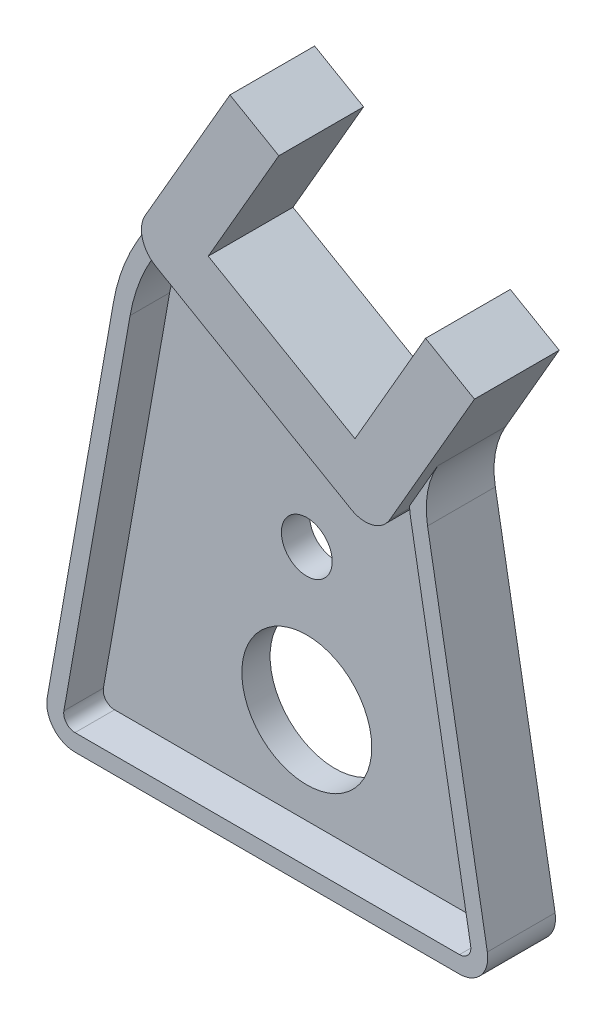
ISO-10303-21;
HEADER;
FILE_DESCRIPTION(('STEP AP214'),'2;1');
FILE_NAME('part.step','',(''),(''),'','','');
FILE_SCHEMA(('AUTOMOTIVE_DESIGN { 1 0 10303 214 1 1 1 1 }'));
ENDSEC;
DATA;
#1=APPLICATION_CONTEXT('core data for automotive mechanical design processes');
#2=APPLICATION_PROTOCOL_DEFINITION('international standard','automotive_design',2000,#1);
#3=PRODUCT_CONTEXT('',#1,'mechanical');
#4=PRODUCT('Part','Part','',(#3));
#5=PRODUCT_RELATED_PRODUCT_CATEGORY('part','',(#4));
#6=PRODUCT_DEFINITION_FORMATION('','',#4);
#7=PRODUCT_DEFINITION_CONTEXT('part definition',#1,'design');
#8=PRODUCT_DEFINITION('design','',#6,#7);
#9=PRODUCT_DEFINITION_SHAPE('','',#8);
#10=(LENGTH_UNIT() NAMED_UNIT(*) SI_UNIT(.MILLI.,.METRE.));
#11=(NAMED_UNIT(*) PLANE_ANGLE_UNIT() SI_UNIT($,.RADIAN.));
#12=(NAMED_UNIT(*) SI_UNIT($,.STERADIAN.) SOLID_ANGLE_UNIT());
#13=UNCERTAINTY_MEASURE_WITH_UNIT(LENGTH_MEASURE(1.E-05),#10,'distance_accuracy_value','');
#14=(GEOMETRIC_REPRESENTATION_CONTEXT(3) GLOBAL_UNCERTAINTY_ASSIGNED_CONTEXT((#13)) GLOBAL_UNIT_ASSIGNED_CONTEXT((#10,
#11,#12)) REPRESENTATION_CONTEXT('',''));
#15=CARTESIAN_POINT('',(0.,0.,0.));
#16=DIRECTION('',(0.,0.,1.));
#17=DIRECTION('',(1.,0.,0.));
#18=AXIS2_PLACEMENT_3D('',#15,#16,#17);
#19=CARTESIAN_POINT('',(0.,0.,5.));
#20=DIRECTION('',(0.,0.,1.));
#21=DIRECTION('',(1.,0.,0.));
#22=AXIS2_PLACEMENT_3D('',#19,#20,#21);
#23=PLANE('',#22);
#24=CARTESIAN_POINT('',(-14.282032302755,89.0192378864667,5.));
#25=DIRECTION('',(0.,0.,1.));
#26=DIRECTION('',(1.,0.,0.));
#27=AXIS2_PLACEMENT_3D('',#24,#25,#26);
#28=CIRCLE('',#27,5.);
#29=CARTESIAN_POINT('',(-18.3053709578019,86.0506109198699,5.));
#30=VERTEX_POINT('',#29);
#31=CARTESIAN_POINT('',(-16.782032302755,84.6891108675445,5.));
#32=VERTEX_POINT('',#31);
#33=EDGE_CURVE('E227',#30,#32,#28,.T.);
#34=ORIENTED_EDGE('',*,*,#33,.F.);
#35=DIRECTION('',(-0.500000000000017,-0.866025403784429,0.));
#36=VECTOR('',#35,1.);
#37=CARTESIAN_POINT('',(-50.9900357522409,29.4391108675463,5.));
#38=LINE('',#37,#36);
#39=CARTESIAN_POINT('',(-20.4875099346972,82.2710353427109,5.));
#40=VERTEX_POINT('',#39);
#41=EDGE_CURVE('E361',#30,#40,#38,.T.);
#42=ORIENTED_EDGE('',*,*,#41,.T.);
#43=CARTESIAN_POINT('',(7.22530298640504,66.2710353427109,5.));
#44=DIRECTION('',(0.,0.,1.));
#45=DIRECTION('',(1.,0.,0.));
#46=AXIS2_PLACEMENT_3D('',#43,#44,#45);
#47=CIRCLE('',#46,32.0000000000001);
#48=CARTESIAN_POINT('',(-24.2885451099856,71.8277770280526,5.));
#49=VERTEX_POINT('',#48);
#50=EDGE_CURVE('E368',#40,#49,#47,.T.);
#51=ORIENTED_EDGE('',*,*,#50,.T.);
#52=DIRECTION('',(-0.173648177666928,-0.984807753012209,0.));
#53=VECTOR('',#52,1.);
#54=CARTESIAN_POINT('',(-35.8394291566816,6.31945833351249,5.));
#55=LINE('',#54,#53);
#56=CARTESIAN_POINT('',(-36.0108475430534,5.34729635533387,5.));
#57=VERTEX_POINT('',#56);
#58=EDGE_CURVE('E369',#49,#57,#55,.T.);
#59=ORIENTED_EDGE('',*,*,#58,.T.);
#60=CARTESIAN_POINT('',(-34.041232037029,5.,5.));
#61=DIRECTION('',(0.,0.,1.));
#62=DIRECTION('',(1.,0.,0.));
#63=AXIS2_PLACEMENT_3D('',#60,#61,#62);
#64=CIRCLE('',#63,2.);
#65=CARTESIAN_POINT('',(-34.0412320370289,3.,5.));
#66=VERTEX_POINT('',#65);
#67=EDGE_CURVE('E348',#57,#66,#64,.T.);
#68=ORIENTED_EDGE('',*,*,#67,.T.);
#69=DIRECTION('',(-1.,0.,0.));
#70=VECTOR('',#69,1.);
#71=CARTESIAN_POINT('',(0.,3.,5.));
#72=LINE('',#71,#70);
#73=CARTESIAN_POINT('',(34.0412320370289,3.,5.));
#74=VERTEX_POINT('',#73);
#75=EDGE_CURVE('E354',#74,#66,#72,.T.);
#76=ORIENTED_EDGE('',*,*,#75,.F.);
#77=CARTESIAN_POINT('',(34.041232037029,5.,5.));
#78=DIRECTION('',(0.,0.,1.));
#79=DIRECTION('',(1.,0.,0.));
#80=AXIS2_PLACEMENT_3D('',#77,#78,#79);
#81=CIRCLE('',#80,2.);
#82=CARTESIAN_POINT('',(36.0108475430534,5.34729635533391,5.));
#83=VERTEX_POINT('',#82);
#84=EDGE_CURVE('E357',#83,#74,#81,.F.);
#85=ORIENTED_EDGE('',*,*,#84,.F.);
#86=DIRECTION('',(-0.173648177666927,0.984807753012209,0.));
#87=VECTOR('',#86,1.);
#88=CARTESIAN_POINT('',(35.8394291566816,6.31945833351247,5.));
#89=LINE('',#88,#87);
#90=CARTESIAN_POINT('',(25.4265109231425,65.3740522005496,5.));
#91=VERTEX_POINT('',#90);
#92=EDGE_CURVE('E358',#83,#91,#89,.T.);
#93=ORIENTED_EDGE('',*,*,#92,.T.);
#94=CARTESIAN_POINT('',(43.1530504773622,68.4997193985543,5.));
#95=DIRECTION('',(0.,0.,1.));
#96=DIRECTION('',(1.,0.,0.));
#97=AXIS2_PLACEMENT_3D('',#94,#95,#96);
#98=CIRCLE('',#97,18.);
#99=CARTESIAN_POINT('',(25.1877322350626,67.3828754287472,5.));
#100=VERTEX_POINT('',#99);
#101=EDGE_CURVE('E363',#100,#91,#98,.T.);
#102=ORIENTED_EDGE('',*,*,#101,.F.);
#103=DIRECTION('',(-0.499999999999999,-0.866025403784439,0.));
#104=VECTOR('',#103,1.);
#105=CARTESIAN_POINT('',(-10.2868417743717,5.93911086754457,5.));
#106=LINE('',#105,#104);
#107=CARTESIAN_POINT('',(24.6891108675448,66.5192378864669,5.));
#108=VERTEX_POINT('',#107);
#109=EDGE_CURVE('E226',#100,#108,#106,.T.);
#110=ORIENTED_EDGE('',*,*,#109,.T.);
#111=CARTESIAN_POINT('',(20.3589838486225,69.0192378864669,5.));
#112=DIRECTION('',(0.,0.,1.));
#113=DIRECTION('',(1.,0.,0.));
#114=AXIS2_PLACEMENT_3D('',#111,#112,#113);
#115=CIRCLE('',#114,5.);
#116=CARTESIAN_POINT('',(17.8589838486225,64.6891108675447,5.));
#117=VERTEX_POINT('',#116);
#118=EDGE_CURVE('E62',#117,#108,#115,.T.);
#119=ORIENTED_EDGE('',*,*,#118,.F.);
#120=DIRECTION('',(0.86602540378444,-0.499999999999998,0.));
#121=VECTOR('',#120,1.);
#122=CARTESIAN_POINT('',(32.4759526419164,56.2500000000002,5.));
#123=LINE('',#122,#121);
#124=EDGE_CURVE('E57',#32,#117,#123,.T.);
#125=ORIENTED_EDGE('',*,*,#124,.F.);
#126=EDGE_LOOP('',(#34,#42,#51,#59,#68,#76,#85,#93,#102,#110,#119,#125));
#127=FACE_BOUND('',#126,.T.);
#128=CARTESIAN_POINT('',(0.,20.,5.));
#129=DIRECTION('',(0.,0.,1.));
#130=DIRECTION('',(1.,0.,0.));
#131=AXIS2_PLACEMENT_3D('',#128,#129,#130);
#132=CIRCLE('',#131,11.5);
#133=CARTESIAN_POINT('',(11.5,20.,5.));
#134=VERTEX_POINT('',#133);
#135=EDGE_CURVE('E373',#134,#134,#132,.T.);
#136=ORIENTED_EDGE('',*,*,#135,.F.);
#137=EDGE_LOOP('',(#136));
#138=FACE_BOUND('',#137,.T.);
#139=CARTESIAN_POINT('',(0.,45.,5.));
#140=DIRECTION('',(0.,0.,1.));
#141=DIRECTION('',(1.,0.,0.));
#142=AXIS2_PLACEMENT_3D('',#139,#140,#141);
#143=CIRCLE('',#142,4.5);
#144=CARTESIAN_POINT('',(4.5,45.,5.));
#145=VERTEX_POINT('',#144);
#146=EDGE_CURVE('E376',#145,#145,#143,.T.);
#147=ORIENTED_EDGE('',*,*,#146,.F.);
#148=EDGE_LOOP('',(#147));
#149=FACE_BOUND('',#148,.T.);
#150=ADVANCED_FACE('F41',(#127,#138,#149),#23,.T.);
#151=CARTESIAN_POINT('',(49.9759526419163,86.5608891324556,5.));
#152=DIRECTION('',(0.499999999999998,0.86602540378444,0.));
#153=DIRECTION('',(-0.86602540378444,0.499999999999998,0.));
#154=AXIS2_PLACEMENT_3D('',#151,#152,#153);
#155=PLANE('',#154);
#156=DIRECTION('',(0.86602540378444,-0.499999999999998,0.));
#157=VECTOR('',#156,1.);
#158=CARTESIAN_POINT('',(49.9759526419163,86.5608891324556,0.));
#159=LINE('',#158,#157);
#160=CARTESIAN_POINT('',(-3.61215932167733,117.5,0.));
#161=VERTEX_POINT('',#160);
#162=CARTESIAN_POINT('',(5.04809471616708,112.5,0.));
#163=VERTEX_POINT('',#162);
#164=EDGE_CURVE('E375',#161,#163,#159,.T.);
#165=ORIENTED_EDGE('',*,*,#164,.F.);
#166=DIRECTION('',(0.,0.,-1.));
#167=VECTOR('',#166,1.);
#168=CARTESIAN_POINT('',(-3.61215932167733,117.5,5.));
#169=LINE('',#168,#167);
#170=CARTESIAN_POINT('',(-3.61215932167733,117.5,15.));
#171=VERTEX_POINT('',#170);
#172=EDGE_CURVE('E11',#171,#161,#169,.T.);
#173=ORIENTED_EDGE('',*,*,#172,.F.);
#174=DIRECTION('',(0.86602540378444,-0.499999999999998,0.));
#175=VECTOR('',#174,1.);
#176=CARTESIAN_POINT('',(49.9759526419163,86.5608891324556,15.));
#177=LINE('',#176,#175);
#178=CARTESIAN_POINT('',(5.04809471616708,112.5,15.));
#179=VERTEX_POINT('',#178);
#180=EDGE_CURVE('E263',#171,#179,#177,.T.);
#181=ORIENTED_EDGE('',*,*,#180,.T.);
#182=DIRECTION('',(0.,0.,-1.));
#183=VECTOR('',#182,1.);
#184=CARTESIAN_POINT('',(5.04809471616708,112.5,5.));
#185=LINE('',#184,#183);
#186=EDGE_CURVE('E379',#179,#163,#185,.T.);
#187=ORIENTED_EDGE('',*,*,#186,.T.);
#188=EDGE_LOOP('',(#165,#173,#181,#187));
#189=FACE_BOUND('',#188,.T.);
#190=ADVANCED_FACE('F43',(#189),#155,.T.);
#191=CARTESIAN_POINT('',(-53.5881119635935,30.9391108675442,5.));
#192=DIRECTION('',(-0.866025403784441,0.499999999999996,0.));
#193=DIRECTION('',(-0.499999999999996,-0.866025403784441,0.));
#194=AXIS2_PLACEMENT_3D('',#191,#192,#193);
#195=PLANE('',#194);
#196=DIRECTION('',(0.499999999999997,0.866025403784441,0.));
#197=VECTOR('',#196,1.);
#198=CARTESIAN_POINT('',(-53.5881119635935,30.9391108675443,15.));
#199=LINE('',#198,#197);
#200=CARTESIAN_POINT('',(-18.6121593216772,91.5192378864667,15.));
#201=VERTEX_POINT('',#200);
#202=EDGE_CURVE('E238',#201,#171,#199,.T.);
#203=ORIENTED_EDGE('',*,*,#202,.T.);
#204=ORIENTED_EDGE('',*,*,#172,.T.);
#205=DIRECTION('',(0.499999999999996,0.866025403784441,0.));
#206=VECTOR('',#205,1.);
#207=CARTESIAN_POINT('',(-53.5881119635935,30.9391108675442,0.));
#208=LINE('',#207,#206);
#209=CARTESIAN_POINT('',(-23.0855861460504,83.7710353427108,0.));
#210=VERTEX_POINT('',#209);
#211=EDGE_CURVE('E382',#210,#161,#208,.T.);
#212=ORIENTED_EDGE('',*,*,#211,.F.);
#213=DIRECTION('',(0.,0.,-1.));
#214=VECTOR('',#213,1.);
#215=CARTESIAN_POINT('',(-23.0855861460504,83.7710353427108,5.));
#216=LINE('',#215,#214);
#217=CARTESIAN_POINT('',(-23.0855861460504,83.7710353427108,12.));
#218=VERTEX_POINT('',#217);
#219=EDGE_CURVE('E47',#218,#210,#216,.T.);
#220=ORIENTED_EDGE('',*,*,#219,.F.);
#221=DIRECTION('',(0.499999999999996,0.866025403784441,0.));
#222=VECTOR('',#221,1.);
#223=CARTESIAN_POINT('',(-53.5881119635935,30.9391108675442,12.));
#224=LINE('',#223,#222);
#225=CARTESIAN_POINT('',(-18.6121593216772,91.5192378864667,12.));
#226=VERTEX_POINT('',#225);
#227=EDGE_CURVE('E287',#218,#226,#224,.T.);
#228=ORIENTED_EDGE('',*,*,#227,.T.);
#229=DIRECTION('',(0.,0.,-1.));
#230=VECTOR('',#229,1.);
#231=CARTESIAN_POINT('',(-18.6121593216772,91.5192378864667,15.));
#232=LINE('',#231,#230);
#233=EDGE_CURVE('E270',#201,#226,#232,.T.);
#234=ORIENTED_EDGE('',*,*,#233,.F.);
#235=EDGE_LOOP('',(#203,#204,#212,#220,#228,#234));
#236=FACE_BOUND('',#235,.T.);
#237=ADVANCED_FACE('F451',(#236),#195,.T.);
#238=CARTESIAN_POINT('',(7.22530298640504,66.2710353427109,5.));
#239=DIRECTION('',(0.,0.,-1.));
#240=DIRECTION('',(-1.,0.,0.));
#241=AXIS2_PLACEMENT_3D('',#238,#239,#240);
#242=CYLINDRICAL_SURFACE('',#241,35.);
#243=CARTESIAN_POINT('',(7.22530298640504,66.2710353427109,0.));
#244=DIRECTION('',(0.,0.,1.));
#245=DIRECTION('',(1.,0.,0.));
#246=AXIS2_PLACEMENT_3D('',#243,#244,#245);
#247=CIRCLE('',#246,35.);
#248=CARTESIAN_POINT('',(-27.2429683690223,72.3487215610534,0.));
#249=VERTEX_POINT('',#248);
#250=EDGE_CURVE('E384',#249,#210,#247,.F.);
#251=ORIENTED_EDGE('',*,*,#250,.F.);
#252=DIRECTION('',(0.,0.,-1.));
#253=VECTOR('',#252,1.);
#254=CARTESIAN_POINT('',(-27.2429683690223,72.3487215610534,5.));
#255=LINE('',#254,#253);
#256=CARTESIAN_POINT('',(-27.2429683690223,72.3487215610534,12.));
#257=VERTEX_POINT('',#256);
#258=EDGE_CURVE('E450',#257,#249,#255,.T.);
#259=ORIENTED_EDGE('',*,*,#258,.F.);
#260=CARTESIAN_POINT('',(7.22530298640504,66.2710353427109,12.));
#261=DIRECTION('',(0.,0.,1.));
#262=DIRECTION('',(1.,0.,0.));
#263=AXIS2_PLACEMENT_3D('',#260,#261,#262);
#264=CIRCLE('',#263,35.);
#265=EDGE_CURVE('E289',#257,#218,#264,.F.);
#266=ORIENTED_EDGE('',*,*,#265,.T.);
#267=ORIENTED_EDGE('',*,*,#219,.T.);
#268=EDGE_LOOP('',(#251,#259,#266,#267));
#269=FACE_BOUND('',#268,.T.);
#270=ADVANCED_FACE('F452',(#269),#242,.T.);
#271=CARTESIAN_POINT('',(-38.7938524157182,6.84040286651326,5.));
#272=DIRECTION('',(-0.984807753012209,0.173648177666927,0.));
#273=DIRECTION('',(-0.173648177666927,-0.984807753012209,0.));
#274=AXIS2_PLACEMENT_3D('',#271,#272,#273);
#275=PLANE('',#274);
#276=DIRECTION('',(0.173648177666927,0.984807753012209,0.));
#277=VECTOR('',#276,1.);
#278=CARTESIAN_POINT('',(-38.7938524157182,6.84040286651326,0.));
#279=LINE('',#278,#277);
#280=CARTESIAN_POINT('',(-38.96527080209,5.86824088833468,0.));
#281=VERTEX_POINT('',#280);
#282=EDGE_CURVE('E389',#281,#249,#279,.T.);
#283=ORIENTED_EDGE('',*,*,#282,.F.);
#284=DIRECTION('',(0.,0.,-1.));
#285=VECTOR('',#284,1.);
#286=CARTESIAN_POINT('',(-38.96527080209,5.86824088833468,5.));
#287=LINE('',#286,#285);
#288=CARTESIAN_POINT('',(-38.96527080209,5.86824088833468,12.));
#289=VERTEX_POINT('',#288);
#290=EDGE_CURVE('E443',#289,#281,#287,.T.);
#291=ORIENTED_EDGE('',*,*,#290,.F.);
#292=DIRECTION('',(0.173648177666927,0.984807753012209,0.));
#293=VECTOR('',#292,1.);
#294=CARTESIAN_POINT('',(-38.7938524157182,6.84040286651326,12.));
#295=LINE('',#294,#293);
#296=EDGE_CURVE('E295',#289,#257,#295,.T.);
#297=ORIENTED_EDGE('',*,*,#296,.T.);
#298=ORIENTED_EDGE('',*,*,#258,.T.);
#299=EDGE_LOOP('',(#283,#291,#297,#298));
#300=FACE_BOUND('',#299,.T.);
#301=ADVANCED_FACE('F461',(#300),#275,.T.);
#302=CARTESIAN_POINT('',(-34.041232037029,5.,5.));
#303=DIRECTION('',(0.,0.,-1.));
#304=DIRECTION('',(-1.,0.,0.));
#305=AXIS2_PLACEMENT_3D('',#302,#303,#304);
#306=CYLINDRICAL_SURFACE('',#305,5.);
#307=CARTESIAN_POINT('',(-34.041232037029,5.,0.));
#308=DIRECTION('',(0.,0.,1.));
#309=DIRECTION('',(1.,0.,0.));
#310=AXIS2_PLACEMENT_3D('',#307,#308,#309);
#311=CIRCLE('',#310,5.);
#312=CARTESIAN_POINT('',(-34.0412320370289,0.,0.));
#313=VERTEX_POINT('',#312);
#314=EDGE_CURVE('E392',#313,#281,#311,.F.);
#315=ORIENTED_EDGE('',*,*,#314,.F.);
#316=DIRECTION('',(0.,0.,-1.));
#317=VECTOR('',#316,1.);
#318=CARTESIAN_POINT('',(-34.0412320370289,0.,5.));
#319=LINE('',#318,#317);
#320=CARTESIAN_POINT('',(-34.0412320370289,0.,12.));
#321=VERTEX_POINT('',#320);
#322=EDGE_CURVE('E444',#321,#313,#319,.T.);
#323=ORIENTED_EDGE('',*,*,#322,.F.);
#324=CARTESIAN_POINT('',(-34.041232037029,5.,12.));
#325=DIRECTION('',(0.,0.,1.));
#326=DIRECTION('',(1.,0.,0.));
#327=AXIS2_PLACEMENT_3D('',#324,#325,#326);
#328=CIRCLE('',#327,5.);
#329=EDGE_CURVE('E293',#321,#289,#328,.F.);
#330=ORIENTED_EDGE('',*,*,#329,.T.);
#331=ORIENTED_EDGE('',*,*,#290,.T.);
#332=EDGE_LOOP('',(#315,#323,#330,#331));
#333=FACE_BOUND('',#332,.T.);
#334=ADVANCED_FACE('F545',(#333),#306,.T.);
#335=CARTESIAN_POINT('',(0.,0.,5.));
#336=DIRECTION('',(0.,1.,0.));
#337=DIRECTION('',(0.,0.,1.));
#338=AXIS2_PLACEMENT_3D('',#335,#336,#337);
#339=PLANE('',#338);
#340=DIRECTION('',(1.,0.,0.));
#341=VECTOR('',#340,1.);
#342=CARTESIAN_POINT('',(0.,0.,0.));
#343=LINE('',#342,#341);
#344=CARTESIAN_POINT('',(34.0412320370289,0.,0.));
#345=VERTEX_POINT('',#344);
#346=EDGE_CURVE('E391',#313,#345,#343,.T.);
#347=ORIENTED_EDGE('',*,*,#346,.T.);
#348=DIRECTION('',(0.,0.,-1.));
#349=VECTOR('',#348,1.);
#350=CARTESIAN_POINT('',(34.0412320370289,0.,5.));
#351=LINE('',#350,#349);
#352=CARTESIAN_POINT('',(34.0412320370289,0.,12.));
#353=VERTEX_POINT('',#352);
#354=EDGE_CURVE('E439',#353,#345,#351,.T.);
#355=ORIENTED_EDGE('',*,*,#354,.F.);
#356=DIRECTION('',(1.,0.,0.));
#357=VECTOR('',#356,1.);
#358=CARTESIAN_POINT('',(0.,0.,12.));
#359=LINE('',#358,#357);
#360=EDGE_CURVE('E299',#321,#353,#359,.T.);
#361=ORIENTED_EDGE('',*,*,#360,.F.);
#362=ORIENTED_EDGE('',*,*,#322,.T.);
#363=EDGE_LOOP('',(#347,#355,#361,#362));
#364=FACE_BOUND('',#363,.T.);
#365=ADVANCED_FACE('F539',(#364),#339,.F.);
#366=CARTESIAN_POINT('',(34.041232037029,5.,5.));
#367=DIRECTION('',(0.,0.,-1.));
#368=DIRECTION('',(-1.,0.,0.));
#369=AXIS2_PLACEMENT_3D('',#366,#367,#368);
#370=CYLINDRICAL_SURFACE('',#369,5.);
#371=CARTESIAN_POINT('',(34.041232037029,5.,0.));
#372=DIRECTION('',(0.,0.,1.));
#373=DIRECTION('',(1.,0.,0.));
#374=AXIS2_PLACEMENT_3D('',#371,#372,#373);
#375=CIRCLE('',#374,5.);
#376=CARTESIAN_POINT('',(38.96527080209,5.86824088833468,0.));
#377=VERTEX_POINT('',#376);
#378=EDGE_CURVE('E397',#345,#377,#375,.T.);
#379=ORIENTED_EDGE('',*,*,#378,.T.);
#380=DIRECTION('',(0.,0.,-1.));
#381=VECTOR('',#380,1.);
#382=CARTESIAN_POINT('',(38.96527080209,5.86824088833468,5.));
#383=LINE('',#382,#381);
#384=CARTESIAN_POINT('',(38.96527080209,5.86824088833468,12.));
#385=VERTEX_POINT('',#384);
#386=EDGE_CURVE('E437',#385,#377,#383,.T.);
#387=ORIENTED_EDGE('',*,*,#386,.F.);
#388=CARTESIAN_POINT('',(34.041232037029,5.,12.));
#389=DIRECTION('',(0.,0.,1.));
#390=DIRECTION('',(1.,0.,0.));
#391=AXIS2_PLACEMENT_3D('',#388,#389,#390);
#392=CIRCLE('',#391,5.);
#393=EDGE_CURVE('E302',#353,#385,#392,.T.);
#394=ORIENTED_EDGE('',*,*,#393,.F.);
#395=ORIENTED_EDGE('',*,*,#354,.T.);
#396=EDGE_LOOP('',(#379,#387,#394,#395));
#397=FACE_BOUND('',#396,.T.);
#398=ADVANCED_FACE('F540',(#397),#370,.T.);
#399=CARTESIAN_POINT('',(38.7938524157182,6.84040286651325,5.));
#400=DIRECTION('',(0.984807753012209,0.173648177666927,0.));
#401=DIRECTION('',(-0.173648177666927,0.984807753012209,0.));
#402=AXIS2_PLACEMENT_3D('',#399,#400,#401);
#403=PLANE('',#402);
#404=DIRECTION('',(0.173648177666927,-0.984807753012209,0.));
#405=VECTOR('',#404,1.);
#406=CARTESIAN_POINT('',(38.7938524157182,6.84040286651325,0.));
#407=LINE('',#406,#405);
#408=CARTESIAN_POINT('',(28.3809341821791,65.8949967335504,0.));
#409=VERTEX_POINT('',#408);
#410=EDGE_CURVE('E399',#409,#377,#407,.T.);
#411=ORIENTED_EDGE('',*,*,#410,.F.);
#412=DIRECTION('',(0.,0.,-1.));
#413=VECTOR('',#412,1.);
#414=CARTESIAN_POINT('',(28.3809341821791,65.8949967335504,5.));
#415=LINE('',#414,#413);
#416=CARTESIAN_POINT('',(28.3809341821791,65.8949967335504,12.));
#417=VERTEX_POINT('',#416);
#418=EDGE_CURVE('E436',#417,#409,#415,.T.);
#419=ORIENTED_EDGE('',*,*,#418,.F.);
#420=DIRECTION('',(0.173648177666927,-0.984807753012209,0.));
#421=VECTOR('',#420,1.);
#422=CARTESIAN_POINT('',(38.7938524157182,6.84040286651325,12.));
#423=LINE('',#422,#421);
#424=EDGE_CURVE('E304',#417,#385,#423,.T.);
#425=ORIENTED_EDGE('',*,*,#424,.T.);
#426=ORIENTED_EDGE('',*,*,#386,.T.);
#427=EDGE_LOOP('',(#411,#419,#425,#426));
#428=FACE_BOUND('',#427,.T.);
#429=ADVANCED_FACE('F534',(#428),#403,.T.);
#430=CARTESIAN_POINT('',(43.1530504773622,68.4997193985543,5.));
#431=DIRECTION('',(0.,0.,-1.));
#432=DIRECTION('',(-1.,0.,0.));
#433=AXIS2_PLACEMENT_3D('',#430,#431,#432);
#434=CYLINDRICAL_SURFACE('',#433,15.);
#435=CARTESIAN_POINT('',(43.1530504773622,68.4997193985543,0.));
#436=DIRECTION('',(0.,0.,1.));
#437=DIRECTION('',(1.,0.,0.));
#438=AXIS2_PLACEMENT_3D('',#435,#436,#437);
#439=CIRCLE('',#438,15.);
#440=CARTESIAN_POINT('',(30.1626694205957,75.9997193985542,0.));
#441=VERTEX_POINT('',#440);
#442=EDGE_CURVE('E405',#409,#441,#439,.F.);
#443=ORIENTED_EDGE('',*,*,#442,.T.);
#444=DIRECTION('',(0.,0.,-1.));
#445=VECTOR('',#444,1.);
#446=CARTESIAN_POINT('',(30.1626694205957,75.9997193985542,5.));
#447=LINE('',#446,#445);
#448=CARTESIAN_POINT('',(30.1626694205957,75.9997193985543,12.));
#449=VERTEX_POINT('',#448);
#450=EDGE_CURVE('E433',#449,#441,#447,.T.);
#451=ORIENTED_EDGE('',*,*,#450,.F.);
#452=CARTESIAN_POINT('',(43.1530504773622,68.4997193985543,12.));
#453=DIRECTION('',(0.,0.,1.));
#454=DIRECTION('',(1.,0.,0.));
#455=AXIS2_PLACEMENT_3D('',#452,#453,#454);
#456=CIRCLE('',#455,15.);
#457=EDGE_CURVE('E307',#417,#449,#456,.F.);
#458=ORIENTED_EDGE('',*,*,#457,.F.);
#459=ORIENTED_EDGE('',*,*,#418,.T.);
#460=EDGE_LOOP('',(#443,#451,#458,#459));
#461=FACE_BOUND('',#460,.T.);
#462=ADVANCED_FACE('F529',(#461),#434,.F.);
#463=CARTESIAN_POINT('',(-10.2868417743717,5.93911086754457,5.));
#464=DIRECTION('',(-0.866025403784439,0.499999999999999,0.));
#465=DIRECTION('',(-0.499999999999999,-0.866025403784439,0.));
#466=AXIS2_PLACEMENT_3D('',#463,#464,#465);
#467=PLANE('',#466);
#468=DIRECTION('',(0.499999999999999,0.866025403784439,0.));
#469=VECTOR('',#468,1.);
#470=CARTESIAN_POINT('',(-10.2868417743717,5.93911086754457,0.));
#471=LINE('',#470,#469);
#472=CARTESIAN_POINT('',(39.6891108675447,92.5000000000001,0.));
#473=VERTEX_POINT('',#472);
#474=EDGE_CURVE('E404',#441,#473,#471,.T.);
#475=ORIENTED_EDGE('',*,*,#474,.T.);
#476=DIRECTION('',(0.,0.,-1.));
#477=VECTOR('',#476,1.);
#478=CARTESIAN_POINT('',(39.6891108675447,92.5000000000001,5.));
#479=LINE('',#478,#477);
#480=CARTESIAN_POINT('',(39.6891108675447,92.5000000000001,15.));
#481=VERTEX_POINT('',#480);
#482=EDGE_CURVE('E431',#481,#473,#479,.T.);
#483=ORIENTED_EDGE('',*,*,#482,.F.);
#484=DIRECTION('',(0.499999999999999,0.866025403784439,0.));
#485=VECTOR('',#484,1.);
#486=CARTESIAN_POINT('',(-10.2868417743717,5.93911086754457,15.));
#487=LINE('',#486,#485);
#488=CARTESIAN_POINT('',(24.6891108675448,66.5192378864669,15.));
#489=VERTEX_POINT('',#488);
#490=EDGE_CURVE('E247',#489,#481,#487,.T.);
#491=ORIENTED_EDGE('',*,*,#490,.F.);
#492=DIRECTION('',(0.,0.,-1.));
#493=VECTOR('',#492,1.);
#494=CARTESIAN_POINT('',(24.6891108675448,66.5192378864669,15.));
#495=LINE('',#494,#493);
#496=EDGE_CURVE('E267',#489,#108,#495,.T.);
#497=ORIENTED_EDGE('',*,*,#496,.T.);
#498=ORIENTED_EDGE('',*,*,#109,.F.);
#499=DIRECTION('',(0.,0.,-1.));
#500=VECTOR('',#499,1.);
#501=CARTESIAN_POINT('',(25.1877322350626,67.3828754287472,12.));
#502=LINE('',#501,#500);
#503=CARTESIAN_POINT('',(25.1877322350626,67.3828754287472,12.));
#504=VERTEX_POINT('',#503);
#505=EDGE_CURVE('E338',#504,#100,#502,.T.);
#506=ORIENTED_EDGE('',*,*,#505,.F.);
#507=DIRECTION('',(0.499999999999999,0.866025403784439,0.));
#508=VECTOR('',#507,1.);
#509=CARTESIAN_POINT('',(-10.2868417743717,5.93911086754457,12.));
#510=LINE('',#509,#508);
#511=EDGE_CURVE('E309',#504,#449,#510,.T.);
#512=ORIENTED_EDGE('',*,*,#511,.T.);
#513=ORIENTED_EDGE('',*,*,#450,.T.);
#514=EDGE_LOOP('',(#475,#483,#491,#497,#498,#506,#512,#513));
#515=FACE_BOUND('',#514,.T.);
#516=ADVANCED_FACE('F501',(#515),#467,.F.);
#517=CARTESIAN_POINT('',(49.9759526419163,86.5608891324556,5.));
#518=DIRECTION('',(0.499999999999998,0.86602540378444,0.));
#519=DIRECTION('',(-0.86602540378444,0.499999999999998,0.));
#520=AXIS2_PLACEMENT_3D('',#517,#518,#519);
#521=PLANE('',#520);
#522=DIRECTION('',(0.86602540378444,-0.499999999999998,0.));
#523=VECTOR('',#522,1.);
#524=CARTESIAN_POINT('',(49.9759526419163,86.5608891324556,0.));
#525=LINE('',#524,#523);
#526=CARTESIAN_POINT('',(31.0288568297003,97.5000000000001,0.));
#527=VERTEX_POINT('',#526);
#528=EDGE_CURVE('E410',#527,#473,#525,.T.);
#529=ORIENTED_EDGE('',*,*,#528,.F.);
#530=DIRECTION('',(0.,0.,-1.));
#531=VECTOR('',#530,1.);
#532=CARTESIAN_POINT('',(31.0288568297003,97.5000000000001,5.));
#533=LINE('',#532,#531);
#534=CARTESIAN_POINT('',(31.0288568297003,97.5000000000001,15.));
#535=VERTEX_POINT('',#534);
#536=EDGE_CURVE('E427',#535,#527,#533,.T.);
#537=ORIENTED_EDGE('',*,*,#536,.F.);
#538=DIRECTION('',(0.86602540378444,-0.499999999999998,0.));
#539=VECTOR('',#538,1.);
#540=CARTESIAN_POINT('',(49.9759526419163,86.5608891324556,15.));
#541=LINE('',#540,#539);
#542=EDGE_CURVE('E253',#535,#481,#541,.T.);
#543=ORIENTED_EDGE('',*,*,#542,.T.);
#544=ORIENTED_EDGE('',*,*,#482,.T.);
#545=EDGE_LOOP('',(#529,#537,#543,#544));
#546=FACE_BOUND('',#545,.T.);
#547=ADVANCED_FACE('F515',(#546),#521,.T.);
#548=CARTESIAN_POINT('',(-18.947095812216,10.9391108675445,5.));
#549=DIRECTION('',(-0.86602540378444,0.499999999999998,0.));
#550=DIRECTION('',(-0.499999999999998,-0.86602540378444,0.));
#551=AXIS2_PLACEMENT_3D('',#548,#549,#550);
#552=PLANE('',#551);
#553=DIRECTION('',(0.499999999999998,0.86602540378444,0.));
#554=VECTOR('',#553,1.);
#555=CARTESIAN_POINT('',(-18.947095812216,10.9391108675445,0.));
#556=LINE('',#555,#554);
#557=CARTESIAN_POINT('',(18.5288568297003,75.849364905389,0.));
#558=VERTEX_POINT('',#557);
#559=EDGE_CURVE('E408',#558,#527,#556,.T.);
#560=ORIENTED_EDGE('',*,*,#559,.F.);
#561=DIRECTION('',(0.,0.,-1.));
#562=VECTOR('',#561,1.);
#563=CARTESIAN_POINT('',(18.5288568297003,75.849364905389,5.));
#564=LINE('',#563,#562);
#565=CARTESIAN_POINT('',(18.5288568297003,75.849364905389,15.));
#566=VERTEX_POINT('',#565);
#567=EDGE_CURVE('E430',#566,#558,#564,.T.);
#568=ORIENTED_EDGE('',*,*,#567,.F.);
#569=DIRECTION('',(0.499999999999998,0.86602540378444,0.));
#570=VECTOR('',#569,1.);
#571=CARTESIAN_POINT('',(-18.947095812216,10.9391108675445,15.));
#572=LINE('',#571,#570);
#573=EDGE_CURVE('E255',#566,#535,#572,.T.);
#574=ORIENTED_EDGE('',*,*,#573,.T.);
#575=ORIENTED_EDGE('',*,*,#536,.T.);
#576=EDGE_LOOP('',(#560,#568,#574,#575));
#577=FACE_BOUND('',#576,.T.);
#578=ADVANCED_FACE('F513',(#577),#552,.T.);
#579=CARTESIAN_POINT('',(37.4759526419163,64.9102540378446,5.));
#580=DIRECTION('',(0.499999999999998,0.86602540378444,0.));
#581=DIRECTION('',(-0.86602540378444,0.499999999999998,0.));
#582=AXIS2_PLACEMENT_3D('',#579,#580,#581);
#583=PLANE('',#582);
#584=DIRECTION('',(0.86602540378444,-0.499999999999998,0.));
#585=VECTOR('',#584,1.);
#586=CARTESIAN_POINT('',(37.4759526419163,64.9102540378446,0.));
#587=LINE('',#586,#585);
#588=CARTESIAN_POINT('',(-7.45190528383283,90.849364905389,0.));
#589=VERTEX_POINT('',#588);
#590=EDGE_CURVE('E413',#589,#558,#587,.T.);
#591=ORIENTED_EDGE('',*,*,#590,.F.);
#592=DIRECTION('',(0.,0.,-1.));
#593=VECTOR('',#592,1.);
#594=CARTESIAN_POINT('',(-7.45190528383283,90.849364905389,5.));
#595=LINE('',#594,#593);
#596=CARTESIAN_POINT('',(-7.45190528383283,90.849364905389,15.));
#597=VERTEX_POINT('',#596);
#598=EDGE_CURVE('E422',#597,#589,#595,.T.);
#599=ORIENTED_EDGE('',*,*,#598,.F.);
#600=DIRECTION('',(0.86602540378444,-0.499999999999998,0.));
#601=VECTOR('',#600,1.);
#602=CARTESIAN_POINT('',(37.4759526419163,64.9102540378446,15.));
#603=LINE('',#602,#601);
#604=EDGE_CURVE('E260',#597,#566,#603,.T.);
#605=ORIENTED_EDGE('',*,*,#604,.T.);
#606=ORIENTED_EDGE('',*,*,#567,.T.);
#607=EDGE_LOOP('',(#591,#599,#605,#606));
#608=FACE_BOUND('',#607,.T.);
#609=ADVANCED_FACE('F518',(#608),#583,.T.);
#610=CARTESIAN_POINT('',(0.,20.,5.));
#611=DIRECTION('',(0.,0.,-1.));
#612=DIRECTION('',(-1.,0.,0.));
#613=AXIS2_PLACEMENT_3D('',#610,#611,#612);
#614=CYLINDRICAL_SURFACE('',#613,11.5);
#615=ORIENTED_EDGE('',*,*,#135,.T.);
#616=EDGE_LOOP('',(#615));
#617=FACE_BOUND('',#616,.T.);
#618=CARTESIAN_POINT('',(0.,20.,0.));
#619=DIRECTION('',(0.,0.,1.));
#620=DIRECTION('',(1.,0.,0.));
#621=AXIS2_PLACEMENT_3D('',#618,#619,#620);
#622=CIRCLE('',#621,11.5);
#623=CARTESIAN_POINT('',(11.5,20.,0.));
#624=VERTEX_POINT('',#623);
#625=EDGE_CURVE('E420',#624,#624,#622,.T.);
#626=ORIENTED_EDGE('',*,*,#625,.F.);
#627=EDGE_LOOP('',(#626));
#628=FACE_BOUND('',#627,.T.);
#629=ADVANCED_FACE('F567',(#617,#628),#614,.F.);
#630=CARTESIAN_POINT('',(-44.9278579257491,25.9391108675443,5.));
#631=DIRECTION('',(0.86602540378444,-0.499999999999997,0.));
#632=DIRECTION('',(0.499999999999997,0.86602540378444,0.));
#633=AXIS2_PLACEMENT_3D('',#630,#631,#632);
#634=PLANE('',#633);
#635=DIRECTION('',(-0.499999999999997,-0.86602540378444,0.));
#636=VECTOR('',#635,1.);
#637=CARTESIAN_POINT('',(-44.9278579257491,25.9391108675443,0.));
#638=LINE('',#637,#636);
#639=EDGE_CURVE('E418',#163,#589,#638,.T.);
#640=ORIENTED_EDGE('',*,*,#639,.F.);
#641=ORIENTED_EDGE('',*,*,#186,.F.);
#642=DIRECTION('',(-0.499999999999997,-0.86602540378444,0.));
#643=VECTOR('',#642,1.);
#644=CARTESIAN_POINT('',(-44.9278579257491,25.9391108675443,15.));
#645=LINE('',#644,#643);
#646=EDGE_CURVE('E257',#179,#597,#645,.T.);
#647=ORIENTED_EDGE('',*,*,#646,.T.);
#648=ORIENTED_EDGE('',*,*,#598,.T.);
#649=EDGE_LOOP('',(#640,#641,#647,#648));
#650=FACE_BOUND('',#649,.T.);
#651=ADVANCED_FACE('F523',(#650),#634,.T.);
#652=CARTESIAN_POINT('',(0.,45.,5.));
#653=DIRECTION('',(0.,0.,-1.));
#654=DIRECTION('',(-1.,0.,0.));
#655=AXIS2_PLACEMENT_3D('',#652,#653,#654);
#656=CYLINDRICAL_SURFACE('',#655,4.5);
#657=ORIENTED_EDGE('',*,*,#146,.T.);
#658=EDGE_LOOP('',(#657));
#659=FACE_BOUND('',#658,.T.);
#660=CARTESIAN_POINT('',(0.,45.,0.));
#661=DIRECTION('',(0.,0.,1.));
#662=DIRECTION('',(1.,0.,0.));
#663=AXIS2_PLACEMENT_3D('',#660,#661,#662);
#664=CIRCLE('',#663,4.5);
#665=CARTESIAN_POINT('',(4.5,45.,0.));
#666=VERTEX_POINT('',#665);
#667=EDGE_CURVE('E380',#666,#666,#664,.T.);
#668=ORIENTED_EDGE('',*,*,#667,.F.);
#669=EDGE_LOOP('',(#668));
#670=FACE_BOUND('',#669,.T.);
#671=ADVANCED_FACE('F565',(#659,#670),#656,.F.);
#672=CARTESIAN_POINT('',(0.,0.,0.));
#673=DIRECTION('',(0.,0.,1.));
#674=DIRECTION('',(1.,0.,0.));
#675=AXIS2_PLACEMENT_3D('',#672,#673,#674);
#676=PLANE('',#675);
#677=ORIENTED_EDGE('',*,*,#211,.T.);
#678=ORIENTED_EDGE('',*,*,#164,.T.);
#679=ORIENTED_EDGE('',*,*,#639,.T.);
#680=ORIENTED_EDGE('',*,*,#590,.T.);
#681=ORIENTED_EDGE('',*,*,#559,.T.);
#682=ORIENTED_EDGE('',*,*,#528,.T.);
#683=ORIENTED_EDGE('',*,*,#474,.F.);
#684=ORIENTED_EDGE('',*,*,#442,.F.);
#685=ORIENTED_EDGE('',*,*,#410,.T.);
#686=ORIENTED_EDGE('',*,*,#378,.F.);
#687=ORIENTED_EDGE('',*,*,#346,.F.);
#688=ORIENTED_EDGE('',*,*,#314,.T.);
#689=ORIENTED_EDGE('',*,*,#282,.T.);
#690=ORIENTED_EDGE('',*,*,#250,.T.);
#691=EDGE_LOOP('',(#677,#678,#679,#680,#681,#682,#683,#684,#685,#686,#687,#688,#689,#690));
#692=FACE_BOUND('',#691,.T.);
#693=ORIENTED_EDGE('',*,*,#625,.T.);
#694=EDGE_LOOP('',(#693));
#695=FACE_BOUND('',#694,.T.);
#696=ORIENTED_EDGE('',*,*,#667,.T.);
#697=EDGE_LOOP('',(#696));
#698=FACE_BOUND('',#697,.T.);
#699=ADVANCED_FACE('F456',(#692,#695,#698),#676,.F.);
#700=CARTESIAN_POINT('',(-35.8394291566816,6.31945833351249,12.));
#701=DIRECTION('',(-0.984807753012208,0.173648177666928,0.));
#702=DIRECTION('',(-0.173648177666928,-0.984807753012209,0.));
#703=AXIS2_PLACEMENT_3D('',#700,#701,#702);
#704=PLANE('',#703);
#705=ORIENTED_EDGE('',*,*,#58,.F.);
#706=DIRECTION('',(0.,0.,-1.));
#707=VECTOR('',#706,1.);
#708=CARTESIAN_POINT('',(-24.2885451099856,71.8277770280526,12.));
#709=LINE('',#708,#707);
#710=CARTESIAN_POINT('',(-24.2885451099856,71.8277770280526,12.));
#711=VERTEX_POINT('',#710);
#712=EDGE_CURVE('E350',#711,#49,#709,.T.);
#713=ORIENTED_EDGE('',*,*,#712,.F.);
#714=DIRECTION('',(0.173648177666928,0.984807753012209,0.));
#715=VECTOR('',#714,1.);
#716=CARTESIAN_POINT('',(-35.8394291566816,6.31945833351249,12.));
#717=LINE('',#716,#715);
#718=CARTESIAN_POINT('',(-36.0108475430534,5.34729635533387,12.));
#719=VERTEX_POINT('',#718);
#720=EDGE_CURVE('E280',#719,#711,#717,.T.);
#721=ORIENTED_EDGE('',*,*,#720,.F.);
#722=DIRECTION('',(0.,0.,-1.));
#723=VECTOR('',#722,1.);
#724=CARTESIAN_POINT('',(-36.0108475430534,5.34729635533387,12.));
#725=LINE('',#724,#723);
#726=EDGE_CURVE('E326',#719,#57,#725,.T.);
#727=ORIENTED_EDGE('',*,*,#726,.T.);
#728=EDGE_LOOP('',(#705,#713,#721,#727));
#729=FACE_BOUND('',#728,.T.);
#730=ADVANCED_FACE('F481',(#729),#704,.F.);
#731=CARTESIAN_POINT('',(7.22530298640504,66.2710353427109,12.));
#732=DIRECTION('',(0.,0.,-1.));
#733=DIRECTION('',(-1.,0.,0.));
#734=AXIS2_PLACEMENT_3D('',#731,#732,#733);
#735=CYLINDRICAL_SURFACE('',#734,32.0000000000001);
#736=ORIENTED_EDGE('',*,*,#50,.F.);
#737=DIRECTION('',(0.,0.,-1.));
#738=VECTOR('',#737,1.);
#739=CARTESIAN_POINT('',(-20.4875099346972,82.2710353427109,12.));
#740=LINE('',#739,#738);
#741=CARTESIAN_POINT('',(-20.4875099346972,82.2710353427109,12.));
#742=VERTEX_POINT('',#741);
#743=EDGE_CURVE('E344',#742,#40,#740,.T.);
#744=ORIENTED_EDGE('',*,*,#743,.F.);
#745=CARTESIAN_POINT('',(7.22530298640504,66.2710353427109,12.));
#746=DIRECTION('',(0.,0.,1.));
#747=DIRECTION('',(1.,0.,0.));
#748=AXIS2_PLACEMENT_3D('',#745,#746,#747);
#749=CIRCLE('',#748,32.0000000000001);
#750=EDGE_CURVE('E278',#711,#742,#749,.F.);
#751=ORIENTED_EDGE('',*,*,#750,.F.);
#752=ORIENTED_EDGE('',*,*,#712,.T.);
#753=EDGE_LOOP('',(#736,#744,#751,#752));
#754=FACE_BOUND('',#753,.T.);
#755=ADVANCED_FACE('F480',(#754),#735,.F.);
#756=CARTESIAN_POINT('',(-50.9900357522409,29.4391108675463,12.));
#757=DIRECTION('',(-0.866025403784429,0.500000000000017,0.));
#758=DIRECTION('',(-0.500000000000017,-0.866025403784429,0.));
#759=AXIS2_PLACEMENT_3D('',#756,#757,#758);
#760=PLANE('',#759);
#761=ORIENTED_EDGE('',*,*,#41,.F.);
#762=DIRECTION('',(0.,0.,-1.));
#763=VECTOR('',#762,1.);
#764=CARTESIAN_POINT('',(-18.3053709578019,86.0506109198699,12.));
#765=LINE('',#764,#763);
#766=CARTESIAN_POINT('',(-18.3053709578019,86.0506109198699,12.));
#767=VERTEX_POINT('',#766);
#768=EDGE_CURVE('E345',#767,#30,#765,.T.);
#769=ORIENTED_EDGE('',*,*,#768,.F.);
#770=DIRECTION('',(0.500000000000017,0.866025403784429,0.));
#771=VECTOR('',#770,1.);
#772=CARTESIAN_POINT('',(-50.9900357522409,29.4391108675463,12.));
#773=LINE('',#772,#771);
#774=EDGE_CURVE('E285',#742,#767,#773,.T.);
#775=ORIENTED_EDGE('',*,*,#774,.F.);
#776=ORIENTED_EDGE('',*,*,#743,.T.);
#777=EDGE_LOOP('',(#761,#769,#775,#776));
#778=FACE_BOUND('',#777,.T.);
#779=ADVANCED_FACE('F471',(#778),#760,.F.);
#780=CARTESIAN_POINT('',(43.1530504773622,68.4997193985543,12.));
#781=DIRECTION('',(0.,0.,-1.));
#782=DIRECTION('',(-1.,0.,0.));
#783=AXIS2_PLACEMENT_3D('',#780,#781,#782);
#784=CYLINDRICAL_SURFACE('',#783,18.);
#785=ORIENTED_EDGE('',*,*,#505,.T.);
#786=ORIENTED_EDGE('',*,*,#101,.T.);
#787=DIRECTION('',(0.,0.,-1.));
#788=VECTOR('',#787,1.);
#789=CARTESIAN_POINT('',(25.4265109231425,65.3740522005496,12.));
#790=LINE('',#789,#788);
#791=CARTESIAN_POINT('',(25.4265109231425,65.3740522005496,12.));
#792=VERTEX_POINT('',#791);
#793=EDGE_CURVE('E340',#792,#91,#790,.T.);
#794=ORIENTED_EDGE('',*,*,#793,.F.);
#795=CARTESIAN_POINT('',(43.1530504773622,68.4997193985543,12.));
#796=DIRECTION('',(0.,0.,1.));
#797=DIRECTION('',(1.,0.,0.));
#798=AXIS2_PLACEMENT_3D('',#795,#796,#797);
#799=CIRCLE('',#798,18.);
#800=EDGE_CURVE('E311',#792,#504,#799,.F.);
#801=ORIENTED_EDGE('',*,*,#800,.T.);
#802=EDGE_LOOP('',(#785,#786,#794,#801));
#803=FACE_BOUND('',#802,.T.);
#804=ADVANCED_FACE('F613',(#803),#784,.T.);
#805=CARTESIAN_POINT('',(35.8394291566816,6.31945833351247,12.));
#806=DIRECTION('',(0.984807753012208,0.173648177666927,0.));
#807=DIRECTION('',(-0.173648177666927,0.984807753012209,0.));
#808=AXIS2_PLACEMENT_3D('',#805,#806,#807);
#809=PLANE('',#808);
#810=ORIENTED_EDGE('',*,*,#92,.F.);
#811=DIRECTION('',(0.,0.,-1.));
#812=VECTOR('',#811,1.);
#813=CARTESIAN_POINT('',(36.0108475430534,5.34729635533391,12.));
#814=LINE('',#813,#812);
#815=CARTESIAN_POINT('',(36.0108475430534,5.34729635533391,12.));
#816=VERTEX_POINT('',#815);
#817=EDGE_CURVE('E331',#816,#83,#814,.T.);
#818=ORIENTED_EDGE('',*,*,#817,.F.);
#819=DIRECTION('',(0.173648177666927,-0.984807753012209,0.));
#820=VECTOR('',#819,1.);
#821=CARTESIAN_POINT('',(35.8394291566816,6.31945833351247,12.));
#822=LINE('',#821,#820);
#823=EDGE_CURVE('E316',#792,#816,#822,.T.);
#824=ORIENTED_EDGE('',*,*,#823,.F.);
#825=ORIENTED_EDGE('',*,*,#793,.T.);
#826=EDGE_LOOP('',(#810,#818,#824,#825));
#827=FACE_BOUND('',#826,.T.);
#828=ADVANCED_FACE('F499',(#827),#809,.F.);
#829=CARTESIAN_POINT('',(34.041232037029,5.,12.));
#830=DIRECTION('',(0.,0.,-1.));
#831=DIRECTION('',(-1.,0.,0.));
#832=AXIS2_PLACEMENT_3D('',#829,#830,#831);
#833=CYLINDRICAL_SURFACE('',#832,2.);
#834=ORIENTED_EDGE('',*,*,#817,.T.);
#835=ORIENTED_EDGE('',*,*,#84,.T.);
#836=DIRECTION('',(0.,0.,-1.));
#837=VECTOR('',#836,1.);
#838=CARTESIAN_POINT('',(34.0412320370289,3.,12.));
#839=LINE('',#838,#837);
#840=CARTESIAN_POINT('',(34.0412320370289,3.,12.));
#841=VERTEX_POINT('',#840);
#842=EDGE_CURVE('E332',#841,#74,#839,.T.);
#843=ORIENTED_EDGE('',*,*,#842,.F.);
#844=CARTESIAN_POINT('',(34.041232037029,5.,12.));
#845=DIRECTION('',(0.,0.,1.));
#846=DIRECTION('',(1.,0.,0.));
#847=AXIS2_PLACEMENT_3D('',#844,#845,#846);
#848=CIRCLE('',#847,2.);
#849=EDGE_CURVE('E318',#841,#816,#848,.T.);
#850=ORIENTED_EDGE('',*,*,#849,.T.);
#851=EDGE_LOOP('',(#834,#835,#843,#850));
#852=FACE_BOUND('',#851,.T.);
#853=ADVANCED_FACE('F492',(#852),#833,.F.);
#854=CARTESIAN_POINT('',(0.,3.,12.));
#855=DIRECTION('',(0.,1.,0.));
#856=DIRECTION('',(-1.,0.,0.));
#857=AXIS2_PLACEMENT_3D('',#854,#855,#856);
#858=PLANE('',#857);
#859=ORIENTED_EDGE('',*,*,#842,.T.);
#860=ORIENTED_EDGE('',*,*,#75,.T.);
#861=DIRECTION('',(0.,0.,-1.));
#862=VECTOR('',#861,1.);
#863=CARTESIAN_POINT('',(-34.0412320370289,3.,12.));
#864=LINE('',#863,#862);
#865=CARTESIAN_POINT('',(-34.0412320370289,3.,12.));
#866=VERTEX_POINT('',#865);
#867=EDGE_CURVE('E328',#866,#66,#864,.T.);
#868=ORIENTED_EDGE('',*,*,#867,.F.);
#869=DIRECTION('',(1.,0.,0.));
#870=VECTOR('',#869,1.);
#871=CARTESIAN_POINT('',(0.,3.,12.));
#872=LINE('',#871,#870);
#873=EDGE_CURVE('E321',#866,#841,#872,.T.);
#874=ORIENTED_EDGE('',*,*,#873,.T.);
#875=EDGE_LOOP('',(#859,#860,#868,#874));
#876=FACE_BOUND('',#875,.T.);
#877=ADVANCED_FACE('F489',(#876),#858,.T.);
#878=CARTESIAN_POINT('',(-34.041232037029,5.,12.));
#879=DIRECTION('',(0.,0.,-1.));
#880=DIRECTION('',(-1.,0.,0.));
#881=AXIS2_PLACEMENT_3D('',#878,#879,#880);
#882=CYLINDRICAL_SURFACE('',#881,2.);
#883=ORIENTED_EDGE('',*,*,#67,.F.);
#884=ORIENTED_EDGE('',*,*,#726,.F.);
#885=CARTESIAN_POINT('',(-34.041232037029,5.,12.));
#886=DIRECTION('',(0.,0.,1.));
#887=DIRECTION('',(1.,0.,0.));
#888=AXIS2_PLACEMENT_3D('',#885,#886,#887);
#889=CIRCLE('',#888,2.);
#890=EDGE_CURVE('E322',#866,#719,#889,.F.);
#891=ORIENTED_EDGE('',*,*,#890,.F.);
#892=ORIENTED_EDGE('',*,*,#867,.T.);
#893=EDGE_LOOP('',(#883,#884,#891,#892));
#894=FACE_BOUND('',#893,.T.);
#895=ADVANCED_FACE('F484',(#894),#882,.F.);
#896=CARTESIAN_POINT('',(0.,0.,12.));
#897=DIRECTION('',(0.,0.,1.));
#898=DIRECTION('',(1.,0.,0.));
#899=AXIS2_PLACEMENT_3D('',#896,#897,#898);
#900=PLANE('',#899);
#901=ORIENTED_EDGE('',*,*,#720,.T.);
#902=ORIENTED_EDGE('',*,*,#750,.T.);
#903=ORIENTED_EDGE('',*,*,#774,.T.);
#904=CARTESIAN_POINT('',(-14.282032302755,89.0192378864667,12.));
#905=DIRECTION('',(0.,0.,1.));
#906=DIRECTION('',(1.,0.,0.));
#907=AXIS2_PLACEMENT_3D('',#904,#905,#906);
#908=CIRCLE('',#907,5.);
#909=EDGE_CURVE('E281',#767,#226,#908,.F.);
#910=ORIENTED_EDGE('',*,*,#909,.T.);
#911=ORIENTED_EDGE('',*,*,#227,.F.);
#912=ORIENTED_EDGE('',*,*,#265,.F.);
#913=ORIENTED_EDGE('',*,*,#296,.F.);
#914=ORIENTED_EDGE('',*,*,#329,.F.);
#915=ORIENTED_EDGE('',*,*,#360,.T.);
#916=ORIENTED_EDGE('',*,*,#393,.T.);
#917=ORIENTED_EDGE('',*,*,#424,.F.);
#918=ORIENTED_EDGE('',*,*,#457,.T.);
#919=ORIENTED_EDGE('',*,*,#511,.F.);
#920=ORIENTED_EDGE('',*,*,#800,.F.);
#921=ORIENTED_EDGE('',*,*,#823,.T.);
#922=ORIENTED_EDGE('',*,*,#849,.F.);
#923=ORIENTED_EDGE('',*,*,#873,.F.);
#924=ORIENTED_EDGE('',*,*,#890,.T.);
#925=EDGE_LOOP('',(#901,#902,#903,#910,#911,#912,#913,#914,#915,#916,#917,#918,#919,#920,#921,
#922,#923,#924));
#926=FACE_BOUND('',#925,.T.);
#927=ADVANCED_FACE('F470',(#926),#900,.T.);
#928=CARTESIAN_POINT('',(-14.282032302755,89.0192378864667,15.));
#929=DIRECTION('',(0.,0.,-1.));
#930=DIRECTION('',(-1.,0.,0.));
#931=AXIS2_PLACEMENT_3D('',#928,#929,#930);
#932=CYLINDRICAL_SURFACE('',#931,5.);
#933=ORIENTED_EDGE('',*,*,#909,.F.);
#934=ORIENTED_EDGE('',*,*,#768,.T.);
#935=ORIENTED_EDGE('',*,*,#33,.T.);
#936=DIRECTION('',(0.,0.,-1.));
#937=VECTOR('',#936,1.);
#938=CARTESIAN_POINT('',(-16.782032302755,84.6891108675445,15.));
#939=LINE('',#938,#937);
#940=CARTESIAN_POINT('',(-16.782032302755,84.6891108675445,15.));
#941=VERTEX_POINT('',#940);
#942=EDGE_CURVE('E217',#941,#32,#939,.T.);
#943=ORIENTED_EDGE('',*,*,#942,.F.);
#944=CARTESIAN_POINT('',(-14.282032302755,89.0192378864667,15.));
#945=DIRECTION('',(0.,0.,1.));
#946=DIRECTION('',(1.,0.,0.));
#947=AXIS2_PLACEMENT_3D('',#944,#945,#946);
#948=CIRCLE('',#947,5.);
#949=EDGE_CURVE('E224',#941,#201,#948,.F.);
#950=ORIENTED_EDGE('',*,*,#949,.T.);
#951=ORIENTED_EDGE('',*,*,#233,.T.);
#952=EDGE_LOOP('',(#933,#934,#935,#943,#950,#951));
#953=FACE_BOUND('',#952,.T.);
#954=ADVANCED_FACE('F222',(#953),#932,.T.);
#955=CARTESIAN_POINT('',(32.4759526419164,56.2500000000002,15.));
#956=DIRECTION('',(-0.499999999999998,-0.86602540378444,0.));
#957=DIRECTION('',(0.86602540378444,-0.499999999999998,0.));
#958=AXIS2_PLACEMENT_3D('',#955,#956,#957);
#959=PLANE('',#958);
#960=ORIENTED_EDGE('',*,*,#942,.T.);
#961=ORIENTED_EDGE('',*,*,#124,.T.);
#962=DIRECTION('',(0.,0.,-1.));
#963=VECTOR('',#962,1.);
#964=CARTESIAN_POINT('',(17.8589838486225,64.6891108675447,15.));
#965=LINE('',#964,#963);
#966=CARTESIAN_POINT('',(17.8589838486225,64.6891108675447,15.));
#967=VERTEX_POINT('',#966);
#968=EDGE_CURVE('E228',#967,#117,#965,.T.);
#969=ORIENTED_EDGE('',*,*,#968,.F.);
#970=DIRECTION('',(-0.86602540378444,0.499999999999998,0.));
#971=VECTOR('',#970,1.);
#972=CARTESIAN_POINT('',(32.4759526419164,56.2500000000002,15.));
#973=LINE('',#972,#971);
#974=EDGE_CURVE('E237',#967,#941,#973,.T.);
#975=ORIENTED_EDGE('',*,*,#974,.T.);
#976=EDGE_LOOP('',(#960,#961,#969,#975));
#977=FACE_BOUND('',#976,.T.);
#978=ADVANCED_FACE('F245',(#977),#959,.T.);
#979=CARTESIAN_POINT('',(20.3589838486225,69.0192378864669,15.));
#980=DIRECTION('',(0.,0.,-1.));
#981=DIRECTION('',(-1.,0.,0.));
#982=AXIS2_PLACEMENT_3D('',#979,#980,#981);
#983=CYLINDRICAL_SURFACE('',#982,5.);
#984=ORIENTED_EDGE('',*,*,#968,.T.);
#985=ORIENTED_EDGE('',*,*,#118,.T.);
#986=ORIENTED_EDGE('',*,*,#496,.F.);
#987=CARTESIAN_POINT('',(20.3589838486225,69.0192378864669,15.));
#988=DIRECTION('',(0.,0.,1.));
#989=DIRECTION('',(1.,0.,0.));
#990=AXIS2_PLACEMENT_3D('',#987,#988,#989);
#991=CIRCLE('',#990,5.);
#992=EDGE_CURVE('E241',#489,#967,#991,.F.);
#993=ORIENTED_EDGE('',*,*,#992,.T.);
#994=EDGE_LOOP('',(#984,#985,#986,#993));
#995=FACE_BOUND('',#994,.T.);
#996=ADVANCED_FACE('F510',(#995),#983,.T.);
#997=CARTESIAN_POINT('',(0.,0.,15.));
#998=DIRECTION('',(0.,0.,1.));
#999=DIRECTION('',(1.,0.,0.));
#1000=AXIS2_PLACEMENT_3D('',#997,#998,#999);
#1001=PLANE('',#1000);
#1002=ORIENTED_EDGE('',*,*,#949,.F.);
#1003=ORIENTED_EDGE('',*,*,#974,.F.);
#1004=ORIENTED_EDGE('',*,*,#992,.F.);
#1005=ORIENTED_EDGE('',*,*,#490,.T.);
#1006=ORIENTED_EDGE('',*,*,#542,.F.);
#1007=ORIENTED_EDGE('',*,*,#573,.F.);
#1008=ORIENTED_EDGE('',*,*,#604,.F.);
#1009=ORIENTED_EDGE('',*,*,#646,.F.);
#1010=ORIENTED_EDGE('',*,*,#180,.F.);
#1011=ORIENTED_EDGE('',*,*,#202,.F.);
#1012=EDGE_LOOP('',(#1002,#1003,#1004,#1005,#1006,#1007,#1008,#1009,#1010,#1011));
#1013=FACE_BOUND('',#1012,.T.);
#1014=ADVANCED_FACE('F234',(#1013),#1001,.T.);
#1015=CLOSED_SHELL('',(#150,#190,#237,#270,#301,#334,#365,#398,#429,#462,#516,#547,#578,#609,
#629,#651,#671,#699,#730,#755,#779,#804,#828,#853,#877,#895,#927,#954,#978,#996,#1014));
#1016=MANIFOLD_SOLID_BREP('B2',#1015);
#1017=ADVANCED_BREP_SHAPE_REPRESENTATION('',(#18,#1016),#14);
#1018=SHAPE_DEFINITION_REPRESENTATION(#9,#1017);
ENDSEC;
END-ISO-10303-21;
